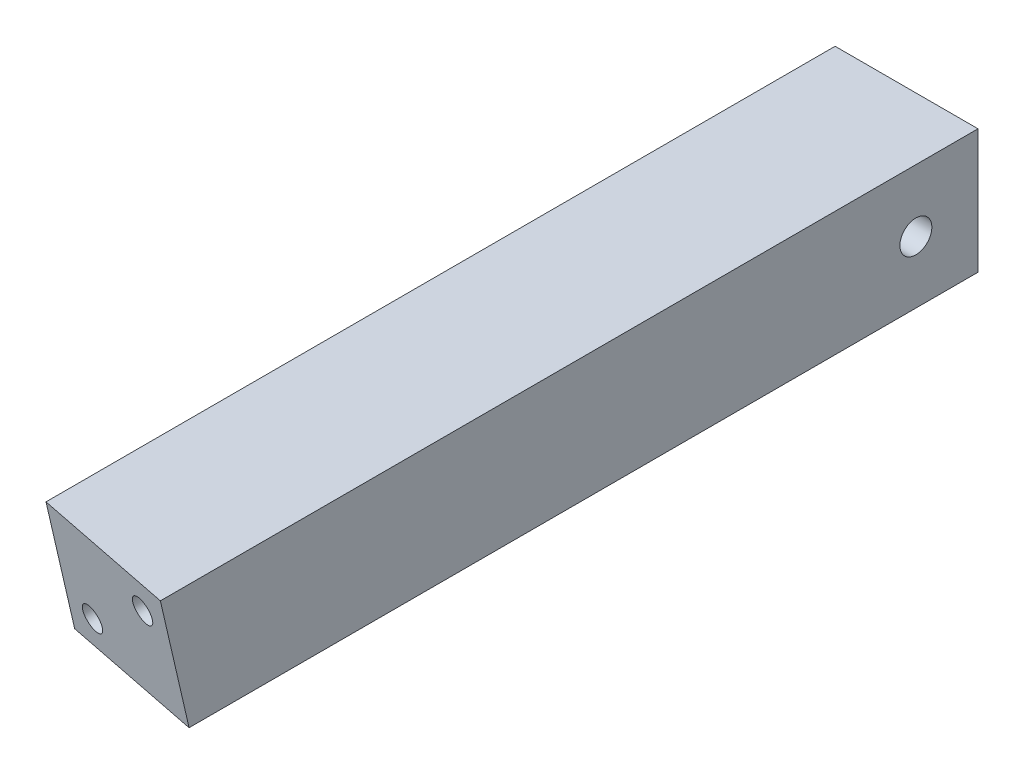
ISO-10303-21;
HEADER;
FILE_DESCRIPTION(('STEP AP214'),'2;1');
FILE_NAME('part.step','',(''),(''),'','','');
FILE_SCHEMA(('AUTOMOTIVE_DESIGN { 1 0 10303 214 1 1 1 1 }'));
ENDSEC;
DATA;
#1=APPLICATION_CONTEXT('core data for automotive mechanical design processes');
#2=APPLICATION_PROTOCOL_DEFINITION('international standard','automotive_design',2000,#1);
#3=PRODUCT_CONTEXT('',#1,'mechanical');
#4=PRODUCT('Part','Part','',(#3));
#5=PRODUCT_RELATED_PRODUCT_CATEGORY('part','',(#4));
#6=PRODUCT_DEFINITION_FORMATION('','',#4);
#7=PRODUCT_DEFINITION_CONTEXT('part definition',#1,'design');
#8=PRODUCT_DEFINITION('design','',#6,#7);
#9=PRODUCT_DEFINITION_SHAPE('','',#8);
#10=(LENGTH_UNIT() NAMED_UNIT(*) SI_UNIT(.MILLI.,.METRE.));
#11=(NAMED_UNIT(*) PLANE_ANGLE_UNIT() SI_UNIT($,.RADIAN.));
#12=(NAMED_UNIT(*) SI_UNIT($,.STERADIAN.) SOLID_ANGLE_UNIT());
#13=UNCERTAINTY_MEASURE_WITH_UNIT(LENGTH_MEASURE(1.E-05),#10,'distance_accuracy_value','');
#14=(GEOMETRIC_REPRESENTATION_CONTEXT(3) GLOBAL_UNCERTAINTY_ASSIGNED_CONTEXT((#13)) GLOBAL_UNIT_ASSIGNED_CONTEXT((#10,
#11,#12)) REPRESENTATION_CONTEXT('',''));
#15=CARTESIAN_POINT('',(0.,0.,0.));
#16=DIRECTION('',(0.,0.,1.));
#17=DIRECTION('',(1.,0.,0.));
#18=AXIS2_PLACEMENT_3D('',#15,#16,#17);
#19=CARTESIAN_POINT('',(-362.881468767956,-840.395664617597,-117.954501012968));
#20=DIRECTION('',(-0.190877495960602,-0.220918397975017,0.956431305934704));
#21=DIRECTION('',(0.,0.974345757792195,0.225056313558081));
#22=AXIS2_PLACEMENT_3D('',#19,#20,#21);
#23=PLANE('',#22);
#24=CARTESIAN_POINT('',(-8.2245098722835,-6.36060008000149,145.472387032501));
#25=DIRECTION('',(0.190877495960602,0.220918397975017,-0.956431305934703));
#26=DIRECTION('',(0.,0.974345757792195,0.225056313558081));
#27=AXIS2_PLACEMENT_3D('',#24,#25,#26);
#28=CIRCLE('',#27,2.52730000000012);
#29=CARTESIAN_POINT('',(-8.2245098722835,-3.89813604633316,146.041171853757));
#30=VERTEX_POINT('',#29);
#31=EDGE_CURVE('E132',#30,#30,#28,.T.);
#32=ORIENTED_EDGE('',*,*,#31,.T.);
#33=EDGE_LOOP('',(#32));
#34=FACE_BOUND('',#33,.T.);
#35=CARTESIAN_POINT('',(8.22450987228346,6.36060008000145,151.693528919635));
#36=DIRECTION('',(0.190877495960602,0.220918397975017,-0.956431305934703));
#37=DIRECTION('',(0.,0.974345757792195,0.225056313558081));
#38=AXIS2_PLACEMENT_3D('',#35,#36,#37);
#39=CIRCLE('',#38,2.52730000000012);
#40=CARTESIAN_POINT('',(8.22450987228346,8.82306411366978,152.262313740891));
#41=VERTEX_POINT('',#40);
#42=EDGE_CURVE('E135',#41,#41,#39,.T.);
#43=ORIENTED_EDGE('',*,*,#42,.T.);
#44=EDGE_LOOP('',(#43));
#45=FACE_BOUND('',#44,.T.);
#46=DIRECTION('',(0.,0.974345757792195,0.225056313558081));
#47=VECTOR('',#46,1.);
#48=CARTESIAN_POINT('',(14.605,-4.0143578996497,150.570471664318));
#49=LINE('',#48,#47);
#50=CARTESIAN_POINT('',(14.605,-12.7,148.564244843544));
#51=VERTEX_POINT('',#50);
#52=CARTESIAN_POINT('',(14.605,12.7,154.431187167313));
#53=VERTEX_POINT('',#52);
#54=EDGE_CURVE('E46',#51,#53,#49,.T.);
#55=ORIENTED_EDGE('',*,*,#54,.T.);
#56=DIRECTION('',(-0.980661193019829,0.,-0.195713117866241));
#57=VECTOR('',#56,1.);
#58=CARTESIAN_POINT('',(-7.01003103597834,12.7,150.117418918974));
#59=LINE('',#58,#57);
#60=CARTESIAN_POINT('',(-14.605,12.7,148.601671108592));
#61=VERTEX_POINT('',#60);
#62=EDGE_CURVE('E97',#53,#61,#59,.T.);
#63=ORIENTED_EDGE('',*,*,#62,.T.);
#64=DIRECTION('',(0.,-0.974345757792195,-0.225056313558081));
#65=VECTOR('',#64,1.);
#66=CARTESIAN_POINT('',(-14.605,-2.73604608624946,145.036222600913));
#67=LINE('',#66,#65);
#68=CARTESIAN_POINT('',(-14.605,-12.7,142.734728784824));
#69=VERTEX_POINT('',#68);
#70=EDGE_CURVE('E109',#61,#69,#67,.T.);
#71=ORIENTED_EDGE('',*,*,#70,.T.);
#72=DIRECTION('',(0.980661193019829,0.,0.195713117866241));
#73=VECTOR('',#72,1.);
#74=CARTESIAN_POINT('',(-5.88399900627334,-12.7,144.475201750967));
#75=LINE('',#74,#73);
#76=EDGE_CURVE('E102',#69,#51,#75,.T.);
#77=ORIENTED_EDGE('',*,*,#76,.T.);
#78=EDGE_LOOP('',(#55,#63,#71,#77));
#79=FACE_BOUND('',#78,.T.);
#80=ADVANCED_FACE('F39',(#34,#45,#79),#23,.T.);
#81=CARTESIAN_POINT('',(-14.605,12.7,188.173587081889));
#82=DIRECTION('',(0.,1.,0.));
#83=DIRECTION('',(0.,0.,-1.));
#84=AXIS2_PLACEMENT_3D('',#81,#82,#83);
#85=PLANE('',#84);
#86=DIRECTION('',(0.,0.,-1.));
#87=VECTOR('',#86,1.);
#88=CARTESIAN_POINT('',(14.605,12.7,188.173587081889));
#89=LINE('',#88,#87);
#90=CARTESIAN_POINT('',(14.605,12.7,-12.7));
#91=VERTEX_POINT('',#90);
#92=EDGE_CURVE('E11',#53,#91,#89,.T.);
#93=ORIENTED_EDGE('',*,*,#92,.T.);
#94=DIRECTION('',(-1.,0.,0.));
#95=VECTOR('',#94,1.);
#96=CARTESIAN_POINT('',(-14.605,12.7,-12.7));
#97=LINE('',#96,#95);
#98=CARTESIAN_POINT('',(-14.605,12.7,-12.7));
#99=VERTEX_POINT('',#98);
#100=EDGE_CURVE('E88',#91,#99,#97,.T.);
#101=ORIENTED_EDGE('',*,*,#100,.T.);
#102=DIRECTION('',(0.,0.,-1.));
#103=VECTOR('',#102,1.);
#104=CARTESIAN_POINT('',(-14.605,12.7,188.173587081889));
#105=LINE('',#104,#103);
#106=EDGE_CURVE('E59',#61,#99,#105,.T.);
#107=ORIENTED_EDGE('',*,*,#106,.F.);
#108=ORIENTED_EDGE('',*,*,#62,.F.);
#109=EDGE_LOOP('',(#93,#101,#107,#108));
#110=FACE_BOUND('',#109,.T.);
#111=ADVANCED_FACE('F95',(#110),#85,.T.);
#112=CARTESIAN_POINT('',(-14.605,-12.7,188.173587081889));
#113=DIRECTION('',(-1.,0.,0.));
#114=DIRECTION('',(0.,0.,-1.));
#115=AXIS2_PLACEMENT_3D('',#112,#113,#114);
#116=PLANE('',#115);
#117=CARTESIAN_POINT('',(-14.605,0.,0.));
#118=DIRECTION('',(-1.,0.,0.));
#119=DIRECTION('',(0.,0.,1.));
#120=AXIS2_PLACEMENT_3D('',#117,#118,#119);
#121=CIRCLE('',#120,3.2639);
#122=CARTESIAN_POINT('',(-14.605,0.,3.2639));
#123=VERTEX_POINT('',#122);
#124=EDGE_CURVE('E141',#123,#123,#121,.T.);
#125=ORIENTED_EDGE('',*,*,#124,.F.);
#126=EDGE_LOOP('',(#125));
#127=FACE_BOUND('',#126,.T.);
#128=ORIENTED_EDGE('',*,*,#106,.T.);
#129=DIRECTION('',(0.,-1.,0.));
#130=VECTOR('',#129,1.);
#131=CARTESIAN_POINT('',(-14.605,-12.7,-12.7));
#132=LINE('',#131,#130);
#133=CARTESIAN_POINT('',(-14.605,-12.7,-12.7));
#134=VERTEX_POINT('',#133);
#135=EDGE_CURVE('E93',#99,#134,#132,.T.);
#136=ORIENTED_EDGE('',*,*,#135,.T.);
#137=DIRECTION('',(0.,0.,-1.));
#138=VECTOR('',#137,1.);
#139=CARTESIAN_POINT('',(-14.605,-12.7,188.173587081889));
#140=LINE('',#139,#138);
#141=EDGE_CURVE('E108',#69,#134,#140,.T.);
#142=ORIENTED_EDGE('',*,*,#141,.F.);
#143=ORIENTED_EDGE('',*,*,#70,.F.);
#144=EDGE_LOOP('',(#128,#136,#142,#143));
#145=FACE_BOUND('',#144,.T.);
#146=ADVANCED_FACE('F112',(#127,#145),#116,.T.);
#147=CARTESIAN_POINT('',(-14.605,-12.7,188.173587081889));
#148=DIRECTION('',(0.,-1.,0.));
#149=DIRECTION('',(0.,0.,1.));
#150=AXIS2_PLACEMENT_3D('',#147,#148,#149);
#151=PLANE('',#150);
#152=ORIENTED_EDGE('',*,*,#141,.T.);
#153=DIRECTION('',(1.,0.,0.));
#154=VECTOR('',#153,1.);
#155=CARTESIAN_POINT('',(-14.605,-12.7,-12.7));
#156=LINE('',#155,#154);
#157=CARTESIAN_POINT('',(14.605,-12.7,-12.7));
#158=VERTEX_POINT('',#157);
#159=EDGE_CURVE('E82',#134,#158,#156,.T.);
#160=ORIENTED_EDGE('',*,*,#159,.T.);
#161=DIRECTION('',(0.,0.,-1.));
#162=VECTOR('',#161,1.);
#163=CARTESIAN_POINT('',(14.605,-12.7,188.173587081889));
#164=LINE('',#163,#162);
#165=EDGE_CURVE('E72',#51,#158,#164,.T.);
#166=ORIENTED_EDGE('',*,*,#165,.F.);
#167=ORIENTED_EDGE('',*,*,#76,.F.);
#168=EDGE_LOOP('',(#152,#160,#166,#167));
#169=FACE_BOUND('',#168,.T.);
#170=ADVANCED_FACE('F113',(#169),#151,.T.);
#171=CARTESIAN_POINT('',(14.605,-12.7,188.173587081889));
#172=DIRECTION('',(1.,0.,0.));
#173=DIRECTION('',(0.,0.,1.));
#174=AXIS2_PLACEMENT_3D('',#171,#172,#173);
#175=PLANE('',#174);
#176=CARTESIAN_POINT('',(14.605,0.,0.));
#177=DIRECTION('',(-1.,0.,0.));
#178=DIRECTION('',(0.,0.,1.));
#179=AXIS2_PLACEMENT_3D('',#176,#177,#178);
#180=CIRCLE('',#179,3.2639);
#181=CARTESIAN_POINT('',(14.605,0.,3.2639));
#182=VERTEX_POINT('',#181);
#183=EDGE_CURVE('E147',#182,#182,#180,.T.);
#184=ORIENTED_EDGE('',*,*,#183,.T.);
#185=EDGE_LOOP('',(#184));
#186=FACE_BOUND('',#185,.T.);
#187=ORIENTED_EDGE('',*,*,#165,.T.);
#188=DIRECTION('',(0.,1.,0.));
#189=VECTOR('',#188,1.);
#190=CARTESIAN_POINT('',(14.605,-12.7,-12.7));
#191=LINE('',#190,#189);
#192=EDGE_CURVE('E79',#158,#91,#191,.T.);
#193=ORIENTED_EDGE('',*,*,#192,.T.);
#194=ORIENTED_EDGE('',*,*,#92,.F.);
#195=ORIENTED_EDGE('',*,*,#54,.F.);
#196=EDGE_LOOP('',(#187,#193,#194,#195));
#197=FACE_BOUND('',#196,.T.);
#198=ADVANCED_FACE('F87',(#186,#197),#175,.T.);
#199=CARTESIAN_POINT('',(0.,0.,-12.7));
#200=DIRECTION('',(0.,0.,1.));
#201=DIRECTION('',(-1.,0.,0.));
#202=AXIS2_PLACEMENT_3D('',#199,#200,#201);
#203=PLANE('',#202);
#204=ORIENTED_EDGE('',*,*,#192,.F.);
#205=ORIENTED_EDGE('',*,*,#159,.F.);
#206=ORIENTED_EDGE('',*,*,#135,.F.);
#207=ORIENTED_EDGE('',*,*,#100,.F.);
#208=EDGE_LOOP('',(#204,#205,#206,#207));
#209=FACE_BOUND('',#208,.T.);
#210=ADVANCED_FACE('F91',(#209),#203,.F.);
#211=CARTESIAN_POINT('',(11.254690120658,9.86767964785485,136.510181937922));
#212=DIRECTION('',(-0.190877495960602,-0.220918397975017,0.956431305934703));
#213=DIRECTION('',(0.,0.974345757792195,0.225056313558081));
#214=AXIS2_PLACEMENT_3D('',#211,#212,#213);
#215=CYLINDRICAL_SURFACE('',#214,2.52730000000012);
#216=CARTESIAN_POINT('',(11.254690120658,9.86767964785485,136.510181937922));
#217=DIRECTION('',(0.190877495960602,0.220918397975017,-0.956431305934703));
#218=DIRECTION('',(0.,0.974345757792195,0.225056313558081));
#219=AXIS2_PLACEMENT_3D('',#216,#217,#218);
#220=CIRCLE('',#219,2.52730000000012);
#221=CARTESIAN_POINT('',(11.254690120658,12.3301436815232,137.078966759177));
#222=VERTEX_POINT('',#221);
#223=EDGE_CURVE('E137',#222,#222,#220,.T.);
#224=CARTESIAN_POINT('',(11.254690120658,12.3301436815232,137.078966759177));
#225=CARTESIAN_POINT('',(11.2231257430708,12.2936116026914,137.23712662357));
#226=CARTESIAN_POINT('',(11.1915613654835,12.2570795238596,137.395286487963));
#227=CARTESIAN_POINT('',(11.1284326103091,12.184015366196,137.711606216749));
#228=CARTESIAN_POINT('',(11.0968682327218,12.1474832873641,137.869766081142));
#229=CARTESIAN_POINT('',(11.0337394775474,12.0744191297005,138.186085809927));
#230=CARTESIAN_POINT('',(11.0021750999601,12.0378870508687,138.34424567432));
#231=CARTESIAN_POINT('',(10.9390463447857,11.9648228932051,138.660565403106));
#232=CARTESIAN_POINT('',(10.9074819671984,11.9282908143733,138.818725267499));
#233=CARTESIAN_POINT('',(10.844353212024,11.8552266567097,139.135044996284));
#234=CARTESIAN_POINT('',(10.8127888344367,11.8186945778779,139.293204860677));
#235=CARTESIAN_POINT('',(10.7496600792622,11.7456304202143,139.609524589463));
#236=CARTESIAN_POINT('',(10.718095701675,11.7090983413825,139.767684453856));
#237=CARTESIAN_POINT('',(10.6549669465005,11.6360341837189,140.084004182642));
#238=CARTESIAN_POINT('',(10.6234025689133,11.5995021048871,140.242164047034));
#239=CARTESIAN_POINT('',(10.5602738137388,11.5264379472234,140.55848377582));
#240=CARTESIAN_POINT('',(10.5287094361516,11.4899058683916,140.716643640213));
#241=CARTESIAN_POINT('',(10.4655806809771,11.416841710728,141.032963368999));
#242=CARTESIAN_POINT('',(10.4340163033899,11.3803096318962,141.191123233391));
#243=CARTESIAN_POINT('',(10.3708875482154,11.3072454742326,141.507442962177));
#244=CARTESIAN_POINT('',(10.3393231706282,11.2707133954008,141.66560282657));
#245=CARTESIAN_POINT('',(10.2761944154537,11.1976492377372,141.981922555356));
#246=CARTESIAN_POINT('',(10.2446300378665,11.1611171589054,142.140082419749));
#247=CARTESIAN_POINT('',(10.181501282692,11.0880530012418,142.456402148534));
#248=CARTESIAN_POINT('',(10.1499369051048,11.05152092241,142.614562012927));
#249=CARTESIAN_POINT('',(10.0868081499303,10.9784567647463,142.930881741713));
#250=CARTESIAN_POINT('',(10.0552437723431,10.9419246859145,143.089041606106));
#251=CARTESIAN_POINT('',(9.99211501716861,10.8688605282509,143.405361334891));
#252=CARTESIAN_POINT('',(9.96055063958138,10.8323284494191,143.563521199284));
#253=CARTESIAN_POINT('',(9.89742188440691,10.7592642917555,143.87984092807));
#254=CARTESIAN_POINT('',(9.86585750681967,10.7227322129237,144.038000792463));
#255=CARTESIAN_POINT('',(9.8027287516452,10.6496680552601,144.354320521248));
#256=CARTESIAN_POINT('',(9.77116437405797,10.6131359764283,144.512480385641));
#257=CARTESIAN_POINT('',(9.7080356188835,10.5400718187647,144.828800114427));
#258=CARTESIAN_POINT('',(9.67647124129626,10.5035397399329,144.98695997882));
#259=CARTESIAN_POINT('',(9.61334248612179,10.4304755822693,145.303279707605));
#260=CARTESIAN_POINT('',(9.58177810853456,10.3939435034374,145.461439571998));
#261=CARTESIAN_POINT('',(9.51864935336009,10.3208793457738,145.777759300784));
#262=CARTESIAN_POINT('',(9.48708497577285,10.284347266942,145.935919165177));
#263=CARTESIAN_POINT('',(9.42395622059838,10.2112831092784,146.252238893963));
#264=CARTESIAN_POINT('',(9.39239184301115,10.1747510304466,146.410398758355));
#265=CARTESIAN_POINT('',(9.32926308783668,10.101686872783,146.726718487141));
#266=CARTESIAN_POINT('',(9.29769871024944,10.0651547939512,146.884878351534));
#267=CARTESIAN_POINT('',(9.23456995507497,9.99209063628758,147.20119808032));
#268=CARTESIAN_POINT('',(9.20300557748774,9.95555855745577,147.359357944713));
#269=CARTESIAN_POINT('',(9.13987682231327,9.88249439979216,147.675677673498));
#270=CARTESIAN_POINT('',(9.10831244472603,9.84596232096035,147.833837537891));
#271=CARTESIAN_POINT('',(9.04518368955156,9.77289816329674,148.150157266677));
#272=CARTESIAN_POINT('',(9.01361931196433,9.73636608446493,148.30831713107));
#273=CARTESIAN_POINT('',(8.95049055678986,9.66330192680132,148.624636859855));
#274=CARTESIAN_POINT('',(8.91892617920263,9.62676984796952,148.782796724248));
#275=CARTESIAN_POINT('',(8.85579742402816,9.55370569030591,149.099116453034));
#276=CARTESIAN_POINT('',(8.82423304644092,9.5171736114741,149.257276317427));
#277=CARTESIAN_POINT('',(8.76110429126645,9.44410945381049,149.573596046212));
#278=CARTESIAN_POINT('',(8.72953991367921,9.40757737497868,149.731755910605));
#279=CARTESIAN_POINT('',(8.66641115850475,9.33451321731507,150.048075639391));
#280=CARTESIAN_POINT('',(8.63484678091751,9.29798113848326,150.206235503784));
#281=CARTESIAN_POINT('',(8.57171802574304,9.22491698081965,150.522555232569));
#282=CARTESIAN_POINT('',(8.5401536481558,9.18838490198784,150.680715096962));
#283=CARTESIAN_POINT('',(8.47702489298134,9.11532074432423,150.997034825748));
#284=CARTESIAN_POINT('',(8.4454605153941,9.07878866549243,151.155194690141));
#285=CARTESIAN_POINT('',(8.38233176021963,9.00572450782881,151.471514418927));
#286=CARTESIAN_POINT('',(8.3507673826324,8.969192428997,151.629674283319));
#287=CARTESIAN_POINT('',(8.28763862745793,8.89612827133339,151.945994012105));
#288=CARTESIAN_POINT('',(8.25607424987069,8.85959619250158,152.104153876498));
#289=CARTESIAN_POINT('',(8.22450987228346,8.82306411366978,152.262313740891));
#290=B_SPLINE_CURVE_WITH_KNOTS('',3,(#224,#225,#226,#227,#228,#229,#230,#231,#232,#233,#234,
#235,#236,#237,#238,#239,#240,#241,#242,#243,#244,#245,#246,#247,#248,#249,#250,#251,#252,#253,
#254,#255,#256,#257,#258,#259,#260,#261,#262,#263,#264,#265,#266,#267,#268,#269,#270,#271,#272,
#273,#274,#275,#276,#277,#278,#279,#280,#281,#282,#283,#284,#285,#286,#287,#288,#289),
.UNSPECIFIED.,.F.,.F.,(4,2,2,2,2,2,2,2,2,2,2,2,2,2,2,2,2,2,2,2,2,2,2,2,2,2,2,2,2,2,2,2,4),(0.,
0.49609374999999,0.99218749999998,1.48828125,1.98437499999999,2.48046874999998,2.97656249999999,
3.47265624999998,3.96874999999997,4.46484374999999,4.96093749999998,5.45703125,5.95312499999999,
6.44921874999998,6.94531249999999,7.44140624999999,7.93749999999998,8.43359374999999,
8.92968749999998,9.42578125,9.92187499999999,10.41796875,10.9140625,11.41015625,11.90625,
12.40234375,12.8984375,13.39453125,13.890625,14.38671875,14.8828125,15.37890625,15.875),.UNSPECIFIED.);
#291=EDGE_CURVE('BSEAM170',#222,#41,#290,.T.);
#292=ORIENTED_EDGE('',*,*,#223,.T.);
#293=ORIENTED_EDGE('',*,*,#42,.F.);
#294=ORIENTED_EDGE('',*,*,#291,.T.);
#295=ORIENTED_EDGE('',*,*,#291,.F.);
#296=EDGE_LOOP('',(#292,#294,#293,#295));
#297=FACE_BOUND('',#296,.T.);
#298=ADVANCED_FACE('F170',(#297),#215,.F.);
#299=CARTESIAN_POINT('',(11.254690120658,9.86767964785485,136.510181937922));
#300=DIRECTION('',(-0.190877495960602,-0.220918397975017,0.956431305934703));
#301=DIRECTION('',(0.,0.974345757792195,0.225056313558081));
#302=AXIS2_PLACEMENT_3D('',#299,#300,#301);
#303=PLANE('',#302);
#304=ORIENTED_EDGE('',*,*,#223,.F.);
#305=EDGE_LOOP('',(#304));
#306=FACE_BOUND('',#305,.T.);
#307=ADVANCED_FACE('F168',(#306),#303,.T.);
#308=CARTESIAN_POINT('',(-5.19432962390895,-2.85352051214809,130.289040050788));
#309=DIRECTION('',(-0.190877495960602,-0.220918397975017,0.956431305934703));
#310=DIRECTION('',(0.,0.974345757792195,0.225056313558081));
#311=AXIS2_PLACEMENT_3D('',#308,#309,#310);
#312=CYLINDRICAL_SURFACE('',#311,2.52730000000012);
#313=CARTESIAN_POINT('',(-5.19432962390895,-2.85352051214809,130.289040050788));
#314=DIRECTION('',(0.190877495960602,0.220918397975017,-0.956431305934703));
#315=DIRECTION('',(0.,0.974345757792195,0.225056313558081));
#316=AXIS2_PLACEMENT_3D('',#313,#314,#315);
#317=CIRCLE('',#316,2.52730000000012);
#318=CARTESIAN_POINT('',(-5.19432962390895,-0.391056478479764,130.857824872043));
#319=VERTEX_POINT('',#318);
#320=EDGE_CURVE('E89',#319,#319,#317,.T.);
#321=CARTESIAN_POINT('',(-5.19432962390895,-0.391056478479764,130.857824872043));
#322=CARTESIAN_POINT('',(-5.22589400149619,-0.427588557311569,131.015984736436));
#323=CARTESIAN_POINT('',(-5.25745837908342,-0.464120636143375,131.174144600829));
#324=CARTESIAN_POINT('',(-5.32058713425789,-0.537184793806989,131.490464329615));
#325=CARTESIAN_POINT('',(-5.35215151184513,-0.573716872638796,131.648624194007));
#326=CARTESIAN_POINT('',(-5.4152802670196,-0.646781030302408,131.964943922793));
#327=CARTESIAN_POINT('',(-5.44684464460683,-0.683313109134213,132.123103787186));
#328=CARTESIAN_POINT('',(-5.5099733997813,-0.756377266797824,132.439423515972));
#329=CARTESIAN_POINT('',(-5.54153777736854,-0.792909345629631,132.597583380365));
#330=CARTESIAN_POINT('',(-5.60466653254301,-0.865973503293245,132.91390310915));
#331=CARTESIAN_POINT('',(-5.63623091013024,-0.902505582125052,133.072062973543));
#332=CARTESIAN_POINT('',(-5.69935966530471,-0.975569739788664,133.388382702329));
#333=CARTESIAN_POINT('',(-5.73092404289195,-1.01210181862047,133.546542566722));
#334=CARTESIAN_POINT('',(-5.79405279806642,-1.08516597628408,133.862862295507));
#335=CARTESIAN_POINT('',(-5.82561717565365,-1.12169805511589,134.0210221599));
#336=CARTESIAN_POINT('',(-5.88874593082812,-1.1947622127795,134.337341888686));
#337=CARTESIAN_POINT('',(-5.92031030841536,-1.23129429161131,134.495501753079));
#338=CARTESIAN_POINT('',(-5.98343906358983,-1.30435844927492,134.811821481864));
#339=CARTESIAN_POINT('',(-6.01500344117706,-1.34089052810672,134.969981346257));
#340=CARTESIAN_POINT('',(-6.07813219635153,-1.41395468577034,135.286301075043));
#341=CARTESIAN_POINT('',(-6.10969657393877,-1.45048676460214,135.444460939436));
#342=CARTESIAN_POINT('',(-6.17282532911324,-1.52355092226576,135.760780668222));
#343=CARTESIAN_POINT('',(-6.20438970670047,-1.56008300109756,135.918940532614));
#344=CARTESIAN_POINT('',(-6.26751846187494,-1.63314715876117,136.2352602614));
#345=CARTESIAN_POINT('',(-6.29908283946217,-1.66967923759298,136.393420125793));
#346=CARTESIAN_POINT('',(-6.36221159463665,-1.74274339525659,136.709739854579));
#347=CARTESIAN_POINT('',(-6.39377597222388,-1.7792754740884,136.867899718971));
#348=CARTESIAN_POINT('',(-6.45690472739835,-1.85233963175201,137.184219447757));
#349=CARTESIAN_POINT('',(-6.48846910498558,-1.88887171058382,137.34237931215));
#350=CARTESIAN_POINT('',(-6.55159786016005,-1.96193586824743,137.658699040936));
#351=CARTESIAN_POINT('',(-6.58316223774729,-1.99846794707924,137.816858905329));
#352=CARTESIAN_POINT('',(-6.64629099292176,-2.07153210474285,138.133178634114));
#353=CARTESIAN_POINT('',(-6.677855370509,-2.10806418357466,138.291338498507));
#354=CARTESIAN_POINT('',(-6.74098412568346,-2.18112834123827,138.607658227293));
#355=CARTESIAN_POINT('',(-6.7725485032707,-2.21766042007007,138.765818091686));
#356=CARTESIAN_POINT('',(-6.83567725844517,-2.29072457773369,139.082137820471));
#357=CARTESIAN_POINT('',(-6.8672416360324,-2.32725665656549,139.240297684864));
#358=CARTESIAN_POINT('',(-6.93037039120687,-2.40032081422911,139.55661741365));
#359=CARTESIAN_POINT('',(-6.96193476879411,-2.43685289306091,139.714777278043));
#360=CARTESIAN_POINT('',(-7.02506352396858,-2.50991705072452,140.031097006828));
#361=CARTESIAN_POINT('',(-7.05662790155581,-2.54644912955633,140.189256871221));
#362=CARTESIAN_POINT('',(-7.11975665673028,-2.61951328721994,140.505576600007));
#363=CARTESIAN_POINT('',(-7.15132103431752,-2.65604536605175,140.6637364644));
#364=CARTESIAN_POINT('',(-7.21444978949199,-2.72910952371536,140.980056193185));
#365=CARTESIAN_POINT('',(-7.24601416707922,-2.76564160254717,141.138216057578));
#366=CARTESIAN_POINT('',(-7.30914292225369,-2.83870576021078,141.454535786364));
#367=CARTESIAN_POINT('',(-7.34070729984093,-2.87523783904259,141.612695650757));
#368=CARTESIAN_POINT('',(-7.4038360550154,-2.9483019967062,141.929015379543));
#369=CARTESIAN_POINT('',(-7.43540043260263,-2.98483407553801,142.087175243935));
#370=CARTESIAN_POINT('',(-7.4985291877771,-3.05789823320162,142.403494972721));
#371=CARTESIAN_POINT('',(-7.53009356536433,-3.09443031203342,142.561654837114));
#372=CARTESIAN_POINT('',(-7.5932223205388,-3.16749446969704,142.8779745659));
#373=CARTESIAN_POINT('',(-7.62478669812604,-3.20402654852884,143.036134430292));
#374=CARTESIAN_POINT('',(-7.68791545330051,-3.27709070619246,143.352454159078));
#375=CARTESIAN_POINT('',(-7.71947983088774,-3.31362278502426,143.510614023471));
#376=CARTESIAN_POINT('',(-7.78260858606221,-3.38668694268787,143.826933752257));
#377=CARTESIAN_POINT('',(-7.81417296364945,-3.42321902151968,143.98509361665));
#378=CARTESIAN_POINT('',(-7.87730171882392,-3.49628317918329,144.301413345435));
#379=CARTESIAN_POINT('',(-7.90886609641116,-3.5328152580151,144.459573209828));
#380=CARTESIAN_POINT('',(-7.97199485158562,-3.60587941567871,144.775892938614));
#381=CARTESIAN_POINT('',(-8.00355922917286,-3.64241149451052,144.934052803007));
#382=CARTESIAN_POINT('',(-8.06668798434733,-3.71547565217413,145.250372531792));
#383=CARTESIAN_POINT('',(-8.09825236193456,-3.75200773100593,145.408532396185));
#384=CARTESIAN_POINT('',(-8.16138111710903,-3.82507188866955,145.724852124971));
#385=CARTESIAN_POINT('',(-8.19294549469627,-3.86160396750136,145.883011989364));
#386=CARTESIAN_POINT('',(-8.2245098722835,-3.89813604633316,146.041171853757));
#387=B_SPLINE_CURVE_WITH_KNOTS('',3,(#321,#322,#323,#324,#325,#326,#327,#328,#329,#330,#331,
#332,#333,#334,#335,#336,#337,#338,#339,#340,#341,#342,#343,#344,#345,#346,#347,#348,#349,#350,
#351,#352,#353,#354,#355,#356,#357,#358,#359,#360,#361,#362,#363,#364,#365,#366,#367,#368,#369,
#370,#371,#372,#373,#374,#375,#376,#377,#378,#379,#380,#381,#382,#383,#384,#385,#386),
.UNSPECIFIED.,.F.,.F.,(4,2,2,2,2,2,2,2,2,2,2,2,2,2,2,2,2,2,2,2,2,2,2,2,2,2,2,2,2,2,2,2,4),(0.,
0.49609374999999,0.99218749999998,1.48828125,1.98437499999999,2.48046874999998,2.97656249999999,
3.47265624999998,3.96874999999997,4.46484374999999,4.96093749999998,5.45703125,5.95312499999999,
6.44921874999998,6.94531249999999,7.44140624999998,7.93749999999997,8.43359374999999,
8.92968749999998,9.42578125,9.92187499999999,10.41796875,10.9140625,11.41015625,11.90625,
12.40234375,12.8984375,13.39453125,13.890625,14.38671875,14.8828125,15.37890625,15.875),.UNSPECIFIED.);
#388=EDGE_CURVE('BSEAM162',#319,#30,#387,.T.);
#389=ORIENTED_EDGE('',*,*,#320,.T.);
#390=ORIENTED_EDGE('',*,*,#31,.F.);
#391=ORIENTED_EDGE('',*,*,#388,.T.);
#392=ORIENTED_EDGE('',*,*,#388,.F.);
#393=EDGE_LOOP('',(#389,#391,#390,#392));
#394=FACE_BOUND('',#393,.T.);
#395=ADVANCED_FACE('F162',(#394),#312,.F.);
#396=CARTESIAN_POINT('',(-5.19432962390895,-2.85352051214809,130.289040050788));
#397=DIRECTION('',(-0.190877495960602,-0.220918397975017,0.956431305934703));
#398=DIRECTION('',(0.,0.974345757792195,0.225056313558081));
#399=AXIS2_PLACEMENT_3D('',#396,#397,#398);
#400=PLANE('',#399);
#401=ORIENTED_EDGE('',*,*,#320,.F.);
#402=EDGE_LOOP('',(#401));
#403=FACE_BOUND('',#402,.T.);
#404=ADVANCED_FACE('F156',(#403),#400,.T.);
#405=CARTESIAN_POINT('',(-14.605,0.,0.));
#406=DIRECTION('',(1.,0.,0.));
#407=DIRECTION('',(0.,0.,1.));
#408=AXIS2_PLACEMENT_3D('',#405,#406,#407);
#409=CYLINDRICAL_SURFACE('',#408,3.2639);
#410=ORIENTED_EDGE('',*,*,#124,.T.);
#411=EDGE_LOOP('',(#410));
#412=FACE_BOUND('',#411,.T.);
#413=ORIENTED_EDGE('',*,*,#183,.F.);
#414=EDGE_LOOP('',(#413));
#415=FACE_BOUND('',#414,.T.);
#416=ADVANCED_FACE('F153',(#412,#415),#409,.F.);
#417=CLOSED_SHELL('',(#80,#111,#146,#170,#198,#210,#298,#307,#395,#404,#416));
#418=MANIFOLD_SOLID_BREP('B2',#417);
#419=ADVANCED_BREP_SHAPE_REPRESENTATION('',(#18,#418),#14);
#420=SHAPE_DEFINITION_REPRESENTATION(#9,#419);
ENDSEC;
END-ISO-10303-21;
